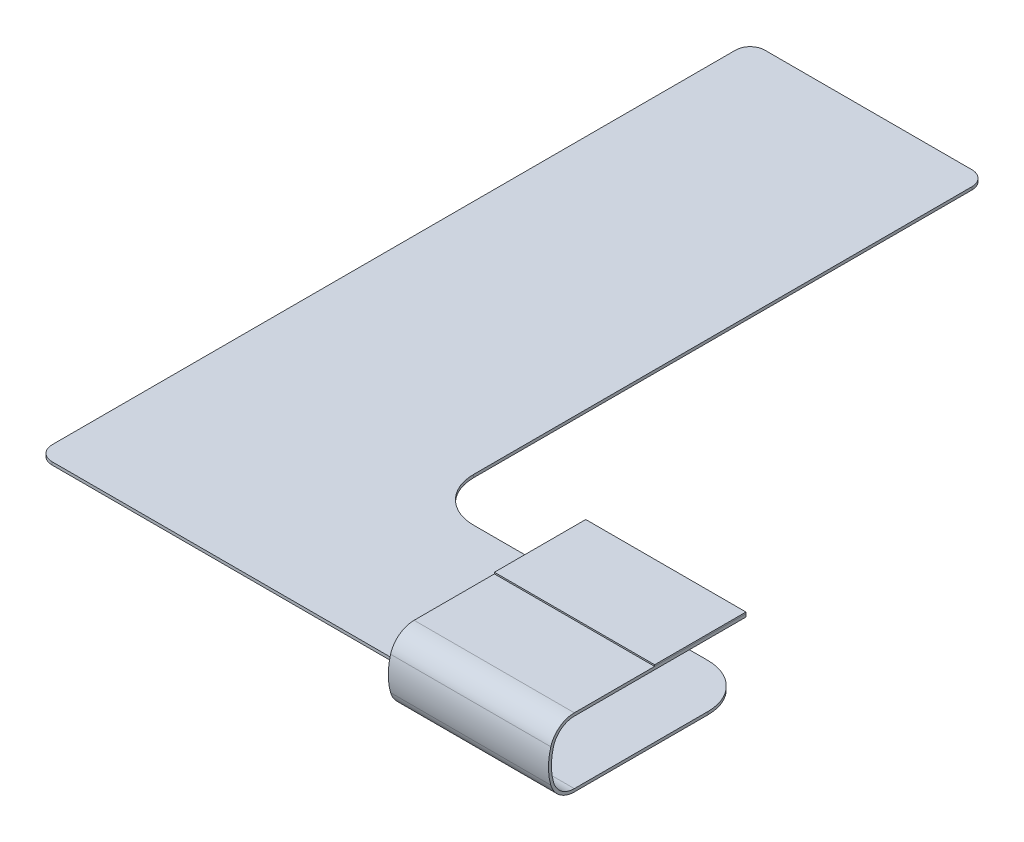
ISO-10303-21;
HEADER;
FILE_DESCRIPTION(('STEP AP214'),'2;1');
FILE_NAME('part.step','',(''),(''),'','','');
FILE_SCHEMA(('AUTOMOTIVE_DESIGN { 1 0 10303 214 1 1 1 1 }'));
ENDSEC;
DATA;
#1=APPLICATION_CONTEXT('core data for automotive mechanical design processes');
#2=APPLICATION_PROTOCOL_DEFINITION('international standard','automotive_design',2000,#1);
#3=PRODUCT_CONTEXT('',#1,'mechanical');
#4=PRODUCT('Part','Part','',(#3));
#5=PRODUCT_RELATED_PRODUCT_CATEGORY('part','',(#4));
#6=PRODUCT_DEFINITION_FORMATION('','',#4);
#7=PRODUCT_DEFINITION_CONTEXT('part definition',#1,'design');
#8=PRODUCT_DEFINITION('design','',#6,#7);
#9=PRODUCT_DEFINITION_SHAPE('','',#8);
#10=(LENGTH_UNIT() NAMED_UNIT(*) SI_UNIT(.MILLI.,.METRE.));
#11=(NAMED_UNIT(*) PLANE_ANGLE_UNIT() SI_UNIT($,.RADIAN.));
#12=(NAMED_UNIT(*) SI_UNIT($,.STERADIAN.) SOLID_ANGLE_UNIT());
#13=UNCERTAINTY_MEASURE_WITH_UNIT(LENGTH_MEASURE(1.E-05),#10,'distance_accuracy_value','');
#14=(GEOMETRIC_REPRESENTATION_CONTEXT(3) GLOBAL_UNCERTAINTY_ASSIGNED_CONTEXT((#13)) GLOBAL_UNIT_ASSIGNED_CONTEXT((#10,
#11,#12)) REPRESENTATION_CONTEXT('',''));
#15=CARTESIAN_POINT('',(0.,0.,0.));
#16=DIRECTION('',(0.,0.,1.));
#17=DIRECTION('',(1.,0.,0.));
#18=AXIS2_PLACEMENT_3D('',#15,#16,#17);
#19=CARTESIAN_POINT('',(-47.8987483955369,4.68,10.3694564606012));
#20=DIRECTION('',(0.,-1.,0.));
#21=DIRECTION('',(0.,0.,-1.));
#22=AXIS2_PLACEMENT_3D('',#19,#20,#21);
#23=PLANE('',#22);
#24=DIRECTION('',(0.,0.,-1.));
#25=VECTOR('',#24,1.);
#26=CARTESIAN_POINT('',(-58.8287483955369,4.68,4.13945646060121));
#27=LINE('',#26,#25);
#28=CARTESIAN_POINT('',(-58.8287483955369,4.68,10.3694564606012));
#29=VERTEX_POINT('',#28);
#30=CARTESIAN_POINT('',(-58.8287483955369,4.68,4.13945646060121));
#31=VERTEX_POINT('',#30);
#32=EDGE_CURVE('P0_E55',#29,#31,#27,.T.);
#33=ORIENTED_EDGE('',*,*,#32,.T.);
#34=DIRECTION('',(1.,0.,0.));
#35=VECTOR('',#34,1.);
#36=CARTESIAN_POINT('',(-47.8987483955369,4.68,4.13945646060121));
#37=LINE('',#36,#35);
#38=CARTESIAN_POINT('',(-47.8987483955369,4.68,4.13945646060121));
#39=VERTEX_POINT('',#38);
#40=EDGE_CURVE('P0_E76',#31,#39,#37,.T.);
#41=ORIENTED_EDGE('',*,*,#40,.T.);
#42=DIRECTION('',(0.,0.,1.));
#43=VECTOR('',#42,1.);
#44=CARTESIAN_POINT('',(-47.8987483955369,4.68,4.13945646060121));
#45=LINE('',#44,#43);
#46=CARTESIAN_POINT('',(-47.8987483955369,4.68,10.3694564606012));
#47=VERTEX_POINT('',#46);
#48=EDGE_CURVE('P0_E58',#39,#47,#45,.T.);
#49=ORIENTED_EDGE('',*,*,#48,.T.);
#50=DIRECTION('',(-1.,0.,0.));
#51=VECTOR('',#50,1.);
#52=CARTESIAN_POINT('',(-47.8987483955369,4.68,10.3694564606012));
#53=LINE('',#52,#51);
#54=EDGE_CURVE('P0_E20',#47,#29,#53,.T.);
#55=ORIENTED_EDGE('',*,*,#54,.T.);
#56=EDGE_LOOP('',(#33,#41,#49,#55));
#57=FACE_BOUND('',#56,.T.);
#58=ADVANCED_FACE('P0_F17',(#57),#23,.T.);
#59=CARTESIAN_POINT('',(-47.8987483955369,4.78,10.3694564606012));
#60=DIRECTION('',(0.,0.,-1.));
#61=DIRECTION('',(-1.,0.,0.));
#62=AXIS2_PLACEMENT_3D('',#59,#60,#61);
#63=PLANE('',#62);
#64=DIRECTION('',(0.,1.,0.));
#65=VECTOR('',#64,1.);
#66=CARTESIAN_POINT('',(-47.8987483955369,4.78,10.3694564606012));
#67=LINE('',#66,#65);
#68=CARTESIAN_POINT('',(-47.8987483955369,4.78,10.3694564606012));
#69=VERTEX_POINT('',#68);
#70=EDGE_CURVE('P0_E78',#47,#69,#67,.T.);
#71=ORIENTED_EDGE('',*,*,#70,.T.);
#72=DIRECTION('',(1.,0.,0.));
#73=VECTOR('',#72,1.);
#74=CARTESIAN_POINT('',(-47.8987483955369,4.78,10.3694564606012));
#75=LINE('',#74,#73);
#76=CARTESIAN_POINT('',(-58.8287483955369,4.78,10.3694564606012));
#77=VERTEX_POINT('',#76);
#78=EDGE_CURVE('P0_E73',#69,#77,#75,.F.);
#79=ORIENTED_EDGE('',*,*,#78,.T.);
#80=DIRECTION('',(0.,1.,0.));
#81=VECTOR('',#80,1.);
#82=CARTESIAN_POINT('',(-58.8287483955369,4.78,10.3694564606012));
#83=LINE('',#82,#81);
#84=EDGE_CURVE('P0_E63',#77,#29,#83,.F.);
#85=ORIENTED_EDGE('',*,*,#84,.T.);
#86=ORIENTED_EDGE('',*,*,#54,.F.);
#87=EDGE_LOOP('',(#71,#79,#85,#86));
#88=FACE_BOUND('',#87,.T.);
#89=ADVANCED_FACE('P0_F72',(#88),#63,.F.);
#90=CARTESIAN_POINT('',(-58.8287483955369,4.78,4.13945646060121));
#91=DIRECTION('',(1.,0.,0.));
#92=DIRECTION('',(0.,0.,-1.));
#93=AXIS2_PLACEMENT_3D('',#90,#91,#92);
#94=PLANE('',#93);
#95=ORIENTED_EDGE('',*,*,#84,.F.);
#96=DIRECTION('',(0.,0.,-1.));
#97=VECTOR('',#96,1.);
#98=CARTESIAN_POINT('',(-58.8287483955369,4.78,10.3694564606012));
#99=LINE('',#98,#97);
#100=CARTESIAN_POINT('',(-58.8287483955369,4.78,4.13945646060121));
#101=VERTEX_POINT('',#100);
#102=EDGE_CURVE('P0_E83',#77,#101,#99,.T.);
#103=ORIENTED_EDGE('',*,*,#102,.T.);
#104=DIRECTION('',(0.,1.,0.));
#105=VECTOR('',#104,1.);
#106=CARTESIAN_POINT('',(-58.8287483955369,4.78,4.13945646060121));
#107=LINE('',#106,#105);
#108=EDGE_CURVE('P0_E69',#101,#31,#107,.F.);
#109=ORIENTED_EDGE('',*,*,#108,.T.);
#110=ORIENTED_EDGE('',*,*,#32,.F.);
#111=EDGE_LOOP('',(#95,#103,#109,#110));
#112=FACE_BOUND('',#111,.T.);
#113=ADVANCED_FACE('P0_F66',(#112),#94,.F.);
#114=CARTESIAN_POINT('',(-47.8987483955369,4.78,4.13945646060121));
#115=DIRECTION('',(0.,0.,1.));
#116=DIRECTION('',(1.,0.,0.));
#117=AXIS2_PLACEMENT_3D('',#114,#115,#116);
#118=PLANE('',#117);
#119=ORIENTED_EDGE('',*,*,#108,.F.);
#120=DIRECTION('',(1.,0.,0.));
#121=VECTOR('',#120,1.);
#122=CARTESIAN_POINT('',(-47.8987483955369,4.78,4.13945646060121));
#123=LINE('',#122,#121);
#124=CARTESIAN_POINT('',(-47.8987483955369,4.78,4.13945646060121));
#125=VERTEX_POINT('',#124);
#126=EDGE_CURVE('P0_E26',#101,#125,#123,.T.);
#127=ORIENTED_EDGE('',*,*,#126,.T.);
#128=DIRECTION('',(0.,1.,0.));
#129=VECTOR('',#128,1.);
#130=CARTESIAN_POINT('',(-47.8987483955369,4.78,4.13945646060121));
#131=LINE('',#130,#129);
#132=EDGE_CURVE('P0_E34',#125,#39,#131,.F.);
#133=ORIENTED_EDGE('',*,*,#132,.T.);
#134=ORIENTED_EDGE('',*,*,#40,.F.);
#135=EDGE_LOOP('',(#119,#127,#133,#134));
#136=FACE_BOUND('',#135,.T.);
#137=ADVANCED_FACE('P0_F88',(#136),#118,.F.);
#138=CARTESIAN_POINT('',(-47.8987483955369,4.78,4.13945646060121));
#139=DIRECTION('',(-1.,0.,0.));
#140=DIRECTION('',(0.,0.,1.));
#141=AXIS2_PLACEMENT_3D('',#138,#139,#140);
#142=PLANE('',#141);
#143=ORIENTED_EDGE('',*,*,#132,.F.);
#144=DIRECTION('',(0.,0.,-1.));
#145=VECTOR('',#144,1.);
#146=CARTESIAN_POINT('',(-47.8987483955369,4.78,10.3694564606012));
#147=LINE('',#146,#145);
#148=EDGE_CURVE('P0_E11',#125,#69,#147,.F.);
#149=ORIENTED_EDGE('',*,*,#148,.T.);
#150=ORIENTED_EDGE('',*,*,#70,.F.);
#151=ORIENTED_EDGE('',*,*,#48,.F.);
#152=EDGE_LOOP('',(#143,#149,#150,#151));
#153=FACE_BOUND('',#152,.T.);
#154=ADVANCED_FACE('P0_F91',(#153),#142,.F.);
#155=CARTESIAN_POINT('',(-47.8987483955369,4.78,10.3694564606012));
#156=DIRECTION('',(0.,-1.,0.));
#157=DIRECTION('',(0.,0.,-1.));
#158=AXIS2_PLACEMENT_3D('',#155,#156,#157);
#159=PLANE('',#158);
#160=ORIENTED_EDGE('',*,*,#126,.F.);
#161=ORIENTED_EDGE('',*,*,#102,.F.);
#162=ORIENTED_EDGE('',*,*,#78,.F.);
#163=ORIENTED_EDGE('',*,*,#148,.F.);
#164=EDGE_LOOP('',(#160,#161,#162,#163));
#165=FACE_BOUND('',#164,.T.);
#166=ADVANCED_FACE('P0_F90',(#165),#159,.F.);
#167=CLOSED_SHELL('',(#58,#89,#113,#137,#154,#166));
#168=MANIFOLD_SOLID_BREP('P0_B1',#167);
#169=CARTESIAN_POINT('',(-58.8287483955369,2.34,13.5306617763399));
#170=DIRECTION('',(-1.,0.,0.));
#171=DIRECTION('',(0.,0.,1.));
#172=AXIS2_PLACEMENT_3D('',#169,#170,#171);
#173=CYLINDRICAL_SURFACE('',#172,4.08307330034227);
#174=DIRECTION('',(-1.,0.,0.));
#175=VECTOR('',#174,1.);
#176=CARTESIAN_POINT('',(-58.8287483955369,3.47430917471786,17.4530118718972));
#177=LINE('',#176,#175);
#178=CARTESIAN_POINT('',(-58.8287483955369,3.47430917471786,17.4530118718972));
#179=VERTEX_POINT('',#178);
#180=CARTESIAN_POINT('',(-47.8987483955369,3.47430917471786,17.4530118718972));
#181=VERTEX_POINT('',#180);
#182=EDGE_CURVE('P1_E206',#179,#181,#177,.F.);
#183=ORIENTED_EDGE('',*,*,#182,.F.);
#184=CARTESIAN_POINT('',(-58.8287483955369,2.34,13.5306617763399));
#185=DIRECTION('',(-1.,0.,0.));
#186=DIRECTION('',(0.,0.,1.));
#187=AXIS2_PLACEMENT_3D('',#184,#185,#186);
#188=CIRCLE('',#187,4.08307330034227);
#189=CARTESIAN_POINT('',(-58.8287483955369,1.20569082528214,17.4530118718972));
#190=VERTEX_POINT('',#189);
#191=EDGE_CURVE('P1_E161',#179,#190,#188,.F.);
#192=ORIENTED_EDGE('',*,*,#191,.T.);
#193=DIRECTION('',(1.,0.,0.));
#194=VECTOR('',#193,1.);
#195=CARTESIAN_POINT('',(-58.8287483955369,1.20569082528214,17.4530118718972));
#196=LINE('',#195,#194);
#197=CARTESIAN_POINT('',(-47.8987483955369,1.20569082528214,17.4530118718972));
#198=VERTEX_POINT('',#197);
#199=EDGE_CURVE('P1_E160',#198,#190,#196,.F.);
#200=ORIENTED_EDGE('',*,*,#199,.F.);
#201=CARTESIAN_POINT('',(-47.8987483955369,2.34,13.5306617763399));
#202=DIRECTION('',(-1.,0.,0.));
#203=DIRECTION('',(0.,0.,1.));
#204=AXIS2_PLACEMENT_3D('',#201,#202,#203);
#205=CIRCLE('',#204,4.08307330034227);
#206=EDGE_CURVE('P1_E20',#198,#181,#205,.T.);
#207=ORIENTED_EDGE('',*,*,#206,.T.);
#208=EDGE_LOOP('',(#183,#192,#200,#207));
#209=FACE_BOUND('',#208,.T.);
#210=ADVANCED_FACE('P1_F17',(#209),#173,.T.);
#211=CARTESIAN_POINT('',(-58.8287483955369,4.68,4.13945646060121));
#212=DIRECTION('',(0.,0.,-1.));
#213=DIRECTION('',(0.,1.,0.));
#214=AXIS2_PLACEMENT_3D('',#211,#212,#213);
#215=PLANE('',#214);
#216=DIRECTION('',(0.,1.,0.));
#217=VECTOR('',#216,1.);
#218=CARTESIAN_POINT('',(-47.8987483955369,4.68,4.13945646060121));
#219=LINE('',#218,#217);
#220=CARTESIAN_POINT('',(-47.8987483955369,4.68,4.13945646060121));
#221=VERTEX_POINT('',#220);
#222=CARTESIAN_POINT('',(-47.8987483955369,4.48,4.13945646060121));
#223=VERTEX_POINT('',#222);
#224=EDGE_CURVE('P1_E158',#221,#223,#219,.F.);
#225=ORIENTED_EDGE('',*,*,#224,.T.);
#226=DIRECTION('',(1.,0.,0.));
#227=VECTOR('',#226,1.);
#228=CARTESIAN_POINT('',(-58.8287483955369,4.48,4.13945646060121));
#229=LINE('',#228,#227);
#230=CARTESIAN_POINT('',(-58.8287483955369,4.48,4.13945646060121));
#231=VERTEX_POINT('',#230);
#232=EDGE_CURVE('P1_E309',#231,#223,#229,.T.);
#233=ORIENTED_EDGE('',*,*,#232,.F.);
#234=DIRECTION('',(0.,1.,0.));
#235=VECTOR('',#234,1.);
#236=CARTESIAN_POINT('',(-58.8287483955369,0.2,4.13945646060121));
#237=LINE('',#236,#235);
#238=CARTESIAN_POINT('',(-58.8287483955369,4.68,4.13945646060121));
#239=VERTEX_POINT('',#238);
#240=EDGE_CURVE('P1_E210',#231,#239,#237,.T.);
#241=ORIENTED_EDGE('',*,*,#240,.T.);
#242=DIRECTION('',(1.,0.,0.));
#243=VECTOR('',#242,1.);
#244=CARTESIAN_POINT('',(-58.8287483955369,4.68,4.13945646060121));
#245=LINE('',#244,#243);
#246=EDGE_CURVE('P1_E230',#221,#239,#245,.F.);
#247=ORIENTED_EDGE('',*,*,#246,.F.);
#248=EDGE_LOOP('',(#225,#233,#241,#247));
#249=FACE_BOUND('',#248,.T.);
#250=ADVANCED_FACE('P1_F334',(#249),#215,.T.);
#251=CARTESIAN_POINT('',(-58.8287483955369,0.2,14.3492411658369));
#252=DIRECTION('',(1.,0.,0.));
#253=DIRECTION('',(0.,0.,-1.));
#254=AXIS2_PLACEMENT_3D('',#251,#252,#253);
#255=PLANE('',#254);
#256=CARTESIAN_POINT('',(-58.8287483955369,1.66948721818661,15.8492411658369));
#257=DIRECTION('',(1.,0.,0.));
#258=DIRECTION('',(0.,0.,-1.));
#259=AXIS2_PLACEMENT_3D('',#256,#257,#258);
#260=CIRCLE('',#259,1.6694872181866);
#261=CARTESIAN_POINT('',(-58.8287483955369,0.,15.8492411658369));
#262=VERTEX_POINT('',#261);
#263=EDGE_CURVE('P1_E165',#190,#262,#260,.T.);
#264=ORIENTED_EDGE('',*,*,#263,.F.);
#265=ORIENTED_EDGE('',*,*,#191,.F.);
#266=CARTESIAN_POINT('',(-58.8287483955369,3.0105127818134,15.8492411658369));
#267=DIRECTION('',(-1.,0.,0.));
#268=DIRECTION('',(0.,0.,1.));
#269=AXIS2_PLACEMENT_3D('',#266,#267,#268);
#270=CIRCLE('',#269,1.6694872181866);
#271=CARTESIAN_POINT('',(-58.8287483955369,4.68,15.8492411658369));
#272=VERTEX_POINT('',#271);
#273=EDGE_CURVE('P1_E202',#272,#179,#270,.F.);
#274=ORIENTED_EDGE('',*,*,#273,.F.);
#275=DIRECTION('',(0.,0.,1.));
#276=VECTOR('',#275,1.);
#277=CARTESIAN_POINT('',(-58.8287483955369,4.68,15.8492411658369));
#278=LINE('',#277,#276);
#279=EDGE_CURVE('P1_E226',#239,#272,#278,.T.);
#280=ORIENTED_EDGE('',*,*,#279,.F.);
#281=ORIENTED_EDGE('',*,*,#240,.F.);
#282=DIRECTION('',(0.,0.,-1.));
#283=VECTOR('',#282,1.);
#284=CARTESIAN_POINT('',(-58.8287483955369,4.48,15.8492411658369));
#285=LINE('',#284,#283);
#286=CARTESIAN_POINT('',(-58.8287483955369,4.48,15.8492411658369));
#287=VERTEX_POINT('',#286);
#288=EDGE_CURVE('P1_E229',#287,#231,#285,.T.);
#289=ORIENTED_EDGE('',*,*,#288,.F.);
#290=CARTESIAN_POINT('',(-58.8287483955369,3.0105127818134,15.8492411658369));
#291=DIRECTION('',(-1.,0.,0.));
#292=DIRECTION('',(0.,0.,1.));
#293=AXIS2_PLACEMENT_3D('',#290,#291,#292);
#294=CIRCLE('',#293,1.46948721818661);
#295=CARTESIAN_POINT('',(-58.8287483955369,3.41874763607868,17.2608845302094));
#296=VERTEX_POINT('',#295);
#297=EDGE_CURVE('P1_E197',#287,#296,#294,.F.);
#298=ORIENTED_EDGE('',*,*,#297,.T.);
#299=CARTESIAN_POINT('',(-58.8287483955369,2.34,13.5306617763399));
#300=DIRECTION('',(-1.,0.,0.));
#301=DIRECTION('',(0.,0.,1.));
#302=AXIS2_PLACEMENT_3D('',#299,#300,#301);
#303=CIRCLE('',#302,3.88307330034227);
#304=CARTESIAN_POINT('',(-58.8287483955369,1.26125236392132,17.2608845302094));
#305=VERTEX_POINT('',#304);
#306=EDGE_CURVE('P1_E209',#296,#305,#303,.F.);
#307=ORIENTED_EDGE('',*,*,#306,.T.);
#308=CARTESIAN_POINT('',(-58.8287483955369,1.66948721818661,15.8492411658369));
#309=DIRECTION('',(1.,0.,0.));
#310=DIRECTION('',(0.,0.,-1.));
#311=AXIS2_PLACEMENT_3D('',#308,#309,#310);
#312=CIRCLE('',#311,1.46948721818661);
#313=CARTESIAN_POINT('',(-58.8287483955369,0.2,15.8492411658369));
#314=VERTEX_POINT('',#313);
#315=EDGE_CURVE('P1_E177',#305,#314,#312,.T.);
#316=ORIENTED_EDGE('',*,*,#315,.T.);
#317=DIRECTION('',(0.,0.,-1.));
#318=VECTOR('',#317,1.);
#319=CARTESIAN_POINT('',(-58.8287483955369,0.2,14.3492411658369));
#320=LINE('',#319,#318);
#321=CARTESIAN_POINT('',(-58.8287483955369,0.2,14.3492411658369));
#322=VERTEX_POINT('',#321);
#323=EDGE_CURVE('P1_E212',#322,#314,#320,.F.);
#324=ORIENTED_EDGE('',*,*,#323,.F.);
#325=DIRECTION('',(0.,1.,0.));
#326=VECTOR('',#325,1.);
#327=CARTESIAN_POINT('',(-58.8287483955369,0.2,14.3492411658369));
#328=LINE('',#327,#326);
#329=CARTESIAN_POINT('',(-58.8287483955369,0.,14.3492411658369));
#330=VERTEX_POINT('',#329);
#331=EDGE_CURVE('P1_E187',#322,#330,#328,.F.);
#332=ORIENTED_EDGE('',*,*,#331,.T.);
#333=DIRECTION('',(0.,0.,1.));
#334=VECTOR('',#333,1.);
#335=CARTESIAN_POINT('',(-58.8287483955369,0.,14.3492411658369));
#336=LINE('',#335,#334);
#337=EDGE_CURVE('P1_E304',#330,#262,#336,.T.);
#338=ORIENTED_EDGE('',*,*,#337,.T.);
#339=EDGE_LOOP('',(#264,#265,#274,#280,#281,#289,#298,#307,#316,#324,#332,#338));
#340=FACE_BOUND('',#339,.T.);
#341=ADVANCED_FACE('P1_F344',(#340),#255,.F.);
#342=CARTESIAN_POINT('',(-58.8287483955369,2.34,13.5306617763399));
#343=DIRECTION('',(-1.,0.,0.));
#344=DIRECTION('',(0.,0.,1.));
#345=AXIS2_PLACEMENT_3D('',#342,#343,#344);
#346=CYLINDRICAL_SURFACE('',#345,3.88307330034227);
#347=CARTESIAN_POINT('',(-47.8987483955369,2.34,13.5306617763399));
#348=DIRECTION('',(-1.,0.,0.));
#349=DIRECTION('',(0.,0.,1.));
#350=AXIS2_PLACEMENT_3D('',#347,#348,#349);
#351=CIRCLE('',#350,3.88307330034227);
#352=CARTESIAN_POINT('',(-47.8987483955369,1.26125236392132,17.2608845302094));
#353=VERTEX_POINT('',#352);
#354=CARTESIAN_POINT('',(-47.8987483955369,3.41874763607868,17.2608845302094));
#355=VERTEX_POINT('',#354);
#356=EDGE_CURVE('P1_E166',#353,#355,#351,.T.);
#357=ORIENTED_EDGE('',*,*,#356,.F.);
#358=DIRECTION('',(1.,0.,0.));
#359=VECTOR('',#358,1.);
#360=CARTESIAN_POINT('',(-58.8287483955369,1.26125236392133,17.2608845302094));
#361=LINE('',#360,#359);
#362=EDGE_CURVE('P1_E172',#353,#305,#361,.F.);
#363=ORIENTED_EDGE('',*,*,#362,.T.);
#364=ORIENTED_EDGE('',*,*,#306,.F.);
#365=DIRECTION('',(-1.,0.,0.));
#366=VECTOR('',#365,1.);
#367=CARTESIAN_POINT('',(-58.8287483955369,3.41874763607868,17.2608845302094));
#368=LINE('',#367,#366);
#369=EDGE_CURVE('P1_E200',#296,#355,#368,.F.);
#370=ORIENTED_EDGE('',*,*,#369,.T.);
#371=EDGE_LOOP('',(#357,#363,#364,#370));
#372=FACE_BOUND('',#371,.T.);
#373=ADVANCED_FACE('P1_F340',(#372),#346,.F.);
#374=CARTESIAN_POINT('',(-58.8287483955369,1.66948721818661,15.8492411658369));
#375=DIRECTION('',(1.,0.,0.));
#376=DIRECTION('',(0.,0.,-1.));
#377=AXIS2_PLACEMENT_3D('',#374,#375,#376);
#378=CYLINDRICAL_SURFACE('',#377,1.6694872181866);
#379=ORIENTED_EDGE('',*,*,#263,.T.);
#380=DIRECTION('',(1.,0.,0.));
#381=VECTOR('',#380,1.);
#382=CARTESIAN_POINT('',(-86.0287483955369,0.,15.8492411658369));
#383=LINE('',#382,#381);
#384=CARTESIAN_POINT('',(-47.8987483955369,0.,15.8492411658369));
#385=VERTEX_POINT('',#384);
#386=EDGE_CURVE('P1_E170',#262,#385,#383,.T.);
#387=ORIENTED_EDGE('',*,*,#386,.T.);
#388=CARTESIAN_POINT('',(-47.8987483955369,1.66948721818661,15.8492411658369));
#389=DIRECTION('',(1.,0.,0.));
#390=DIRECTION('',(0.,0.,-1.));
#391=AXIS2_PLACEMENT_3D('',#388,#389,#390);
#392=CIRCLE('',#391,1.6694872181866);
#393=EDGE_CURVE('P1_E155',#385,#198,#392,.F.);
#394=ORIENTED_EDGE('',*,*,#393,.T.);
#395=ORIENTED_EDGE('',*,*,#199,.T.);
#396=EDGE_LOOP('',(#379,#387,#394,#395));
#397=FACE_BOUND('',#396,.T.);
#398=ADVANCED_FACE('P1_F168',(#397),#378,.T.);
#399=CARTESIAN_POINT('',(-58.8287483955369,3.0105127818134,15.8492411658369));
#400=DIRECTION('',(-1.,0.,0.));
#401=DIRECTION('',(0.,0.,1.));
#402=AXIS2_PLACEMENT_3D('',#399,#400,#401);
#403=CYLINDRICAL_SURFACE('',#402,1.6694872181866);
#404=DIRECTION('',(1.,0.,0.));
#405=VECTOR('',#404,1.);
#406=CARTESIAN_POINT('',(-58.8287483955369,4.68,15.8492411658369));
#407=LINE('',#406,#405);
#408=CARTESIAN_POINT('',(-47.8987483955369,4.68,15.8492411658369));
#409=VERTEX_POINT('',#408);
#410=EDGE_CURVE('P1_E205',#272,#409,#407,.T.);
#411=ORIENTED_EDGE('',*,*,#410,.F.);
#412=ORIENTED_EDGE('',*,*,#273,.T.);
#413=ORIENTED_EDGE('',*,*,#182,.T.);
#414=CARTESIAN_POINT('',(-47.8987483955369,3.0105127818134,15.8492411658369));
#415=DIRECTION('',(-1.,0.,0.));
#416=DIRECTION('',(0.,0.,1.));
#417=AXIS2_PLACEMENT_3D('',#414,#415,#416);
#418=CIRCLE('',#417,1.6694872181866);
#419=EDGE_CURVE('P1_E157',#181,#409,#418,.T.);
#420=ORIENTED_EDGE('',*,*,#419,.T.);
#421=EDGE_LOOP('',(#411,#412,#413,#420));
#422=FACE_BOUND('',#421,.T.);
#423=ADVANCED_FACE('P1_F544',(#422),#403,.T.);
#424=CARTESIAN_POINT('',(-58.8287483955369,4.68,15.8492411658369));
#425=DIRECTION('',(0.,1.,0.));
#426=DIRECTION('',(0.,0.,1.));
#427=AXIS2_PLACEMENT_3D('',#424,#425,#426);
#428=PLANE('',#427);
#429=ORIENTED_EDGE('',*,*,#246,.T.);
#430=ORIENTED_EDGE('',*,*,#279,.T.);
#431=ORIENTED_EDGE('',*,*,#410,.T.);
#432=DIRECTION('',(0.,0.,1.));
#433=VECTOR('',#432,1.);
#434=CARTESIAN_POINT('',(-47.8987483955369,4.68,15.8492411658369));
#435=LINE('',#434,#433);
#436=EDGE_CURVE('P1_E174',#409,#221,#435,.F.);
#437=ORIENTED_EDGE('',*,*,#436,.T.);
#438=EDGE_LOOP('',(#429,#430,#431,#437));
#439=FACE_BOUND('',#438,.T.);
#440=ADVANCED_FACE('P1_F536',(#439),#428,.T.);
#441=CARTESIAN_POINT('',(-58.8287483955369,4.48,15.8492411658369));
#442=DIRECTION('',(0.,-1.,0.));
#443=DIRECTION('',(0.,0.,-1.));
#444=AXIS2_PLACEMENT_3D('',#441,#442,#443);
#445=PLANE('',#444);
#446=ORIENTED_EDGE('',*,*,#232,.T.);
#447=DIRECTION('',(0.,0.,1.));
#448=VECTOR('',#447,1.);
#449=CARTESIAN_POINT('',(-47.8987483955369,4.48,15.8492411658369));
#450=LINE('',#449,#448);
#451=CARTESIAN_POINT('',(-47.8987483955369,4.48,15.8492411658369));
#452=VERTEX_POINT('',#451);
#453=EDGE_CURVE('P1_E262',#223,#452,#450,.T.);
#454=ORIENTED_EDGE('',*,*,#453,.T.);
#455=DIRECTION('',(-1.,0.,0.));
#456=VECTOR('',#455,1.);
#457=CARTESIAN_POINT('',(-58.8287483955369,4.48,15.8492411658369));
#458=LINE('',#457,#456);
#459=EDGE_CURVE('P1_E201',#452,#287,#458,.T.);
#460=ORIENTED_EDGE('',*,*,#459,.T.);
#461=ORIENTED_EDGE('',*,*,#288,.T.);
#462=EDGE_LOOP('',(#446,#454,#460,#461));
#463=FACE_BOUND('',#462,.T.);
#464=ADVANCED_FACE('P1_F335',(#463),#445,.T.);
#465=CARTESIAN_POINT('',(-58.8287483955369,3.0105127818134,15.8492411658369));
#466=DIRECTION('',(-1.,0.,0.));
#467=DIRECTION('',(0.,0.,1.));
#468=AXIS2_PLACEMENT_3D('',#465,#466,#467);
#469=CYLINDRICAL_SURFACE('',#468,1.46948721818661);
#470=ORIENTED_EDGE('',*,*,#297,.F.);
#471=ORIENTED_EDGE('',*,*,#459,.F.);
#472=CARTESIAN_POINT('',(-47.8987483955369,3.0105127818134,15.8492411658369));
#473=DIRECTION('',(-1.,0.,0.));
#474=DIRECTION('',(0.,0.,1.));
#475=AXIS2_PLACEMENT_3D('',#472,#473,#474);
#476=CIRCLE('',#475,1.46948721818661);
#477=EDGE_CURVE('P1_E260',#452,#355,#476,.F.);
#478=ORIENTED_EDGE('',*,*,#477,.T.);
#479=ORIENTED_EDGE('',*,*,#369,.F.);
#480=EDGE_LOOP('',(#470,#471,#478,#479));
#481=FACE_BOUND('',#480,.T.);
#482=ADVANCED_FACE('P1_F342',(#481),#469,.F.);
#483=CARTESIAN_POINT('',(-86.0287483955369,0.,14.3492411658369));
#484=DIRECTION('',(0.,1.,0.));
#485=DIRECTION('',(0.,0.,1.));
#486=AXIS2_PLACEMENT_3D('',#483,#484,#485);
#487=PLANE('',#486);
#488=CARTESIAN_POINT('',(-85.0287483955369,0.,-33.2784537478612));
#489=DIRECTION('',(0.,-1.,0.));
#490=DIRECTION('',(0.,0.,-1.));
#491=AXIS2_PLACEMENT_3D('',#488,#489,#490);
#492=CIRCLE('',#491,1.);
#493=CARTESIAN_POINT('',(-85.0287483955369,0.,-34.2784537478612));
#494=VERTEX_POINT('',#493);
#495=CARTESIAN_POINT('',(-86.0287483955369,0.,-33.2784537478612));
#496=VERTEX_POINT('',#495);
#497=EDGE_CURVE('P1_E189',#494,#496,#492,.F.);
#498=ORIENTED_EDGE('',*,*,#497,.F.);
#499=DIRECTION('',(1.,0.,0.));
#500=VECTOR('',#499,1.);
#501=CARTESIAN_POINT('',(-69.8987483955369,0.,-34.2784537478612));
#502=LINE('',#501,#500);
#503=CARTESIAN_POINT('',(-70.8987483955369,0.,-34.2784537478612));
#504=VERTEX_POINT('',#503);
#505=EDGE_CURVE('P1_E196',#494,#504,#502,.T.);
#506=ORIENTED_EDGE('',*,*,#505,.T.);
#507=CARTESIAN_POINT('',(-70.8987483955369,0.,-33.2784537478612));
#508=DIRECTION('',(0.,-1.,0.));
#509=DIRECTION('',(0.,0.,-1.));
#510=AXIS2_PLACEMENT_3D('',#507,#508,#509);
#511=CIRCLE('',#510,1.);
#512=CARTESIAN_POINT('',(-69.8987483955369,0.,-33.2784537478612));
#513=VERTEX_POINT('',#512);
#514=EDGE_CURVE('P1_E194',#513,#504,#511,.F.);
#515=ORIENTED_EDGE('',*,*,#514,.F.);
#516=DIRECTION('',(0.,0.,1.));
#517=VECTOR('',#516,1.);
#518=CARTESIAN_POINT('',(-69.8987483955369,0.,3.71924116583694));
#519=LINE('',#518,#517);
#520=CARTESIAN_POINT('',(-69.8987483955369,0.,0.719241165836939));
#521=VERTEX_POINT('',#520);
#522=EDGE_CURVE('P1_E298',#513,#521,#519,.T.);
#523=ORIENTED_EDGE('',*,*,#522,.T.);
#524=CARTESIAN_POINT('',(-66.8987483955369,0.,0.719241165836939));
#525=DIRECTION('',(0.,1.,0.));
#526=DIRECTION('',(0.,0.,1.));
#527=AXIS2_PLACEMENT_3D('',#524,#525,#526);
#528=CIRCLE('',#527,3.);
#529=CARTESIAN_POINT('',(-66.8987483955369,0.,3.71924116583694));
#530=VERTEX_POINT('',#529);
#531=EDGE_CURVE('P1_E250',#521,#530,#528,.T.);
#532=ORIENTED_EDGE('',*,*,#531,.T.);
#533=DIRECTION('',(1.,0.,0.));
#534=VECTOR('',#533,1.);
#535=CARTESIAN_POINT('',(-47.8987483955369,0.,3.71924116583694));
#536=LINE('',#535,#534);
#537=CARTESIAN_POINT('',(-50.8987483955369,0.,3.71924116583694));
#538=VERTEX_POINT('',#537);
#539=EDGE_CURVE('P1_E253',#530,#538,#536,.T.);
#540=ORIENTED_EDGE('',*,*,#539,.T.);
#541=CARTESIAN_POINT('',(-50.8987483955369,0.,6.71924116583694));
#542=DIRECTION('',(0.,-1.,0.));
#543=DIRECTION('',(0.,0.,-1.));
#544=AXIS2_PLACEMENT_3D('',#541,#542,#543);
#545=CIRCLE('',#544,3.);
#546=CARTESIAN_POINT('',(-47.8987483955369,0.,6.71924116583694));
#547=VERTEX_POINT('',#546);
#548=EDGE_CURVE('P1_E254',#547,#538,#545,.F.);
#549=ORIENTED_EDGE('',*,*,#548,.F.);
#550=DIRECTION('',(0.,0.,1.));
#551=VECTOR('',#550,1.);
#552=CARTESIAN_POINT('',(-47.8987483955369,0.,15.8492411658369));
#553=LINE('',#552,#551);
#554=EDGE_CURVE('P1_E259',#547,#385,#553,.T.);
#555=ORIENTED_EDGE('',*,*,#554,.T.);
#556=ORIENTED_EDGE('',*,*,#386,.F.);
#557=ORIENTED_EDGE('',*,*,#337,.F.);
#558=DIRECTION('',(-1.,0.,0.));
#559=VECTOR('',#558,1.);
#560=CARTESIAN_POINT('',(-86.0287483955369,0.,14.3492411658369));
#561=LINE('',#560,#559);
#562=CARTESIAN_POINT('',(-85.0287483955369,0.,14.3492411658369));
#563=VERTEX_POINT('',#562);
#564=EDGE_CURVE('P1_E285',#330,#563,#561,.T.);
#565=ORIENTED_EDGE('',*,*,#564,.T.);
#566=CARTESIAN_POINT('',(-85.0287483955369,0.,13.3492411658369));
#567=DIRECTION('',(0.,-1.,0.));
#568=DIRECTION('',(0.,0.,-1.));
#569=AXIS2_PLACEMENT_3D('',#566,#567,#568);
#570=CIRCLE('',#569,1.);
#571=CARTESIAN_POINT('',(-86.0287483955369,0.,13.3492411658369));
#572=VERTEX_POINT('',#571);
#573=EDGE_CURVE('P1_E184',#572,#563,#570,.F.);
#574=ORIENTED_EDGE('',*,*,#573,.F.);
#575=DIRECTION('',(0.,0.,-1.));
#576=VECTOR('',#575,1.);
#577=CARTESIAN_POINT('',(-86.0287483955369,0.,-34.2784537478612));
#578=LINE('',#577,#576);
#579=EDGE_CURVE('P1_E192',#572,#496,#578,.T.);
#580=ORIENTED_EDGE('',*,*,#579,.T.);
#581=EDGE_LOOP('',(#498,#506,#515,#523,#532,#540,#549,#555,#556,#557,#565,#574,#580));
#582=FACE_BOUND('',#581,.T.);
#583=ADVANCED_FACE('P1_F386',(#582),#487,.F.);
#584=CARTESIAN_POINT('',(-69.8987483955369,0.2,-34.2784537478612));
#585=DIRECTION('',(0.,0.,1.));
#586=DIRECTION('',(1.,0.,0.));
#587=AXIS2_PLACEMENT_3D('',#584,#585,#586);
#588=PLANE('',#587);
#589=DIRECTION('',(0.,-1.,0.));
#590=VECTOR('',#589,1.);
#591=CARTESIAN_POINT('',(-85.0287483955369,0.2,-34.2784537478612));
#592=LINE('',#591,#590);
#593=CARTESIAN_POINT('',(-85.0287483955369,0.2,-34.2784537478612));
#594=VERTEX_POINT('',#593);
#595=EDGE_CURVE('P1_E193',#594,#494,#592,.T.);
#596=ORIENTED_EDGE('',*,*,#595,.F.);
#597=DIRECTION('',(1.,0.,0.));
#598=VECTOR('',#597,1.);
#599=CARTESIAN_POINT('',(-86.0287483955369,0.2,-34.2784537478612));
#600=LINE('',#599,#598);
#601=CARTESIAN_POINT('',(-70.8987483955369,0.2,-34.2784537478612));
#602=VERTEX_POINT('',#601);
#603=EDGE_CURVE('P1_E249',#602,#594,#600,.F.);
#604=ORIENTED_EDGE('',*,*,#603,.F.);
#605=DIRECTION('',(0.,-1.,0.));
#606=VECTOR('',#605,1.);
#607=CARTESIAN_POINT('',(-70.8987483955369,0.2,-34.2784537478612));
#608=LINE('',#607,#606);
#609=EDGE_CURVE('P1_E374',#504,#602,#608,.F.);
#610=ORIENTED_EDGE('',*,*,#609,.F.);
#611=ORIENTED_EDGE('',*,*,#505,.F.);
#612=EDGE_LOOP('',(#596,#604,#610,#611));
#613=FACE_BOUND('',#612,.T.);
#614=ADVANCED_FACE('P1_F505',(#613),#588,.F.);
#615=CARTESIAN_POINT('',(-85.0287483955369,0.2,-33.2784537478612));
#616=DIRECTION('',(0.,-1.,0.));
#617=DIRECTION('',(0.,0.,-1.));
#618=AXIS2_PLACEMENT_3D('',#615,#616,#617);
#619=CYLINDRICAL_SURFACE('',#618,1.);
#620=ORIENTED_EDGE('',*,*,#497,.T.);
#621=DIRECTION('',(0.,1.,0.));
#622=VECTOR('',#621,1.);
#623=CARTESIAN_POINT('',(-86.0287483955369,0.2,-33.2784537478612));
#624=LINE('',#623,#622);
#625=CARTESIAN_POINT('',(-86.0287483955369,0.2,-33.2784537478612));
#626=VERTEX_POINT('',#625);
#627=EDGE_CURVE('P1_E292',#496,#626,#624,.T.);
#628=ORIENTED_EDGE('',*,*,#627,.T.);
#629=CARTESIAN_POINT('',(-85.0287483955369,0.2,-33.2784537478612));
#630=DIRECTION('',(0.,-1.,0.));
#631=DIRECTION('',(0.,0.,-1.));
#632=AXIS2_PLACEMENT_3D('',#629,#630,#631);
#633=CIRCLE('',#632,1.);
#634=EDGE_CURVE('P1_E246',#594,#626,#633,.F.);
#635=ORIENTED_EDGE('',*,*,#634,.F.);
#636=ORIENTED_EDGE('',*,*,#595,.T.);
#637=EDGE_LOOP('',(#620,#628,#635,#636));
#638=FACE_BOUND('',#637,.T.);
#639=ADVANCED_FACE('P1_F496',(#638),#619,.T.);
#640=CARTESIAN_POINT('',(-86.0287483955369,0.2,-34.2784537478612));
#641=DIRECTION('',(1.,0.,0.));
#642=DIRECTION('',(0.,0.,-1.));
#643=AXIS2_PLACEMENT_3D('',#640,#641,#642);
#644=PLANE('',#643);
#645=ORIENTED_EDGE('',*,*,#627,.F.);
#646=ORIENTED_EDGE('',*,*,#579,.F.);
#647=DIRECTION('',(0.,-1.,0.));
#648=VECTOR('',#647,1.);
#649=CARTESIAN_POINT('',(-86.0287483955369,0.2,13.3492411658369));
#650=LINE('',#649,#648);
#651=CARTESIAN_POINT('',(-86.0287483955369,0.2,13.3492411658369));
#652=VERTEX_POINT('',#651);
#653=EDGE_CURVE('P1_E188',#652,#572,#650,.T.);
#654=ORIENTED_EDGE('',*,*,#653,.F.);
#655=DIRECTION('',(0.,0.,1.));
#656=VECTOR('',#655,1.);
#657=CARTESIAN_POINT('',(-86.0287483955369,0.2,14.3492411658369));
#658=LINE('',#657,#656);
#659=EDGE_CURVE('P1_E245',#626,#652,#658,.T.);
#660=ORIENTED_EDGE('',*,*,#659,.F.);
#661=EDGE_LOOP('',(#645,#646,#654,#660));
#662=FACE_BOUND('',#661,.T.);
#663=ADVANCED_FACE('P1_F487',(#662),#644,.F.);
#664=CARTESIAN_POINT('',(-85.0287483955369,0.2,13.3492411658369));
#665=DIRECTION('',(0.,-1.,0.));
#666=DIRECTION('',(0.,0.,-1.));
#667=AXIS2_PLACEMENT_3D('',#664,#665,#666);
#668=CYLINDRICAL_SURFACE('',#667,1.);
#669=ORIENTED_EDGE('',*,*,#573,.T.);
#670=DIRECTION('',(0.,1.,0.));
#671=VECTOR('',#670,1.);
#672=CARTESIAN_POINT('',(-85.0287483955369,0.2,14.3492411658369));
#673=LINE('',#672,#671);
#674=CARTESIAN_POINT('',(-85.0287483955369,0.2,14.3492411658369));
#675=VERTEX_POINT('',#674);
#676=EDGE_CURVE('P1_E183',#563,#675,#673,.T.);
#677=ORIENTED_EDGE('',*,*,#676,.T.);
#678=CARTESIAN_POINT('',(-85.0287483955369,0.2,13.3492411658369));
#679=DIRECTION('',(0.,-1.,0.));
#680=DIRECTION('',(0.,0.,-1.));
#681=AXIS2_PLACEMENT_3D('',#678,#679,#680);
#682=CIRCLE('',#681,1.);
#683=EDGE_CURVE('P1_E241',#652,#675,#682,.F.);
#684=ORIENTED_EDGE('',*,*,#683,.F.);
#685=ORIENTED_EDGE('',*,*,#653,.T.);
#686=EDGE_LOOP('',(#669,#677,#684,#685));
#687=FACE_BOUND('',#686,.T.);
#688=ADVANCED_FACE('P1_F402',(#687),#668,.T.);
#689=CARTESIAN_POINT('',(-86.0287483955369,0.2,14.3492411658369));
#690=DIRECTION('',(0.,0.,-1.));
#691=DIRECTION('',(-1.,0.,0.));
#692=AXIS2_PLACEMENT_3D('',#689,#690,#691);
#693=PLANE('',#692);
#694=ORIENTED_EDGE('',*,*,#676,.F.);
#695=ORIENTED_EDGE('',*,*,#564,.F.);
#696=ORIENTED_EDGE('',*,*,#331,.F.);
#697=DIRECTION('',(1.,0.,0.));
#698=VECTOR('',#697,1.);
#699=CARTESIAN_POINT('',(-86.0287483955369,0.2,14.3492411658369));
#700=LINE('',#699,#698);
#701=EDGE_CURVE('P1_E244',#675,#322,#700,.T.);
#702=ORIENTED_EDGE('',*,*,#701,.F.);
#703=EDGE_LOOP('',(#694,#695,#696,#702));
#704=FACE_BOUND('',#703,.T.);
#705=ADVANCED_FACE('P1_F360',(#704),#693,.F.);
#706=CARTESIAN_POINT('',(-58.8287483955369,1.66948721818661,15.8492411658369));
#707=DIRECTION('',(1.,0.,0.));
#708=DIRECTION('',(0.,0.,-1.));
#709=AXIS2_PLACEMENT_3D('',#706,#707,#708);
#710=CYLINDRICAL_SURFACE('',#709,1.46948721818661);
#711=CARTESIAN_POINT('',(-47.8987483955369,1.66948721818661,15.8492411658369));
#712=DIRECTION('',(1.,0.,0.));
#713=DIRECTION('',(0.,0.,-1.));
#714=AXIS2_PLACEMENT_3D('',#711,#712,#713);
#715=CIRCLE('',#714,1.46948721818661);
#716=CARTESIAN_POINT('',(-47.8987483955369,0.2,15.8492411658369));
#717=VERTEX_POINT('',#716);
#718=EDGE_CURVE('P1_E258',#353,#717,#715,.T.);
#719=ORIENTED_EDGE('',*,*,#718,.T.);
#720=DIRECTION('',(1.,0.,0.));
#721=VECTOR('',#720,1.);
#722=CARTESIAN_POINT('',(-86.0287483955369,0.2,15.8492411658369));
#723=LINE('',#722,#721);
#724=EDGE_CURVE('P1_E281',#314,#717,#723,.T.);
#725=ORIENTED_EDGE('',*,*,#724,.F.);
#726=ORIENTED_EDGE('',*,*,#315,.F.);
#727=ORIENTED_EDGE('',*,*,#362,.F.);
#728=EDGE_LOOP('',(#719,#725,#726,#727));
#729=FACE_BOUND('',#728,.T.);
#730=ADVANCED_FACE('P1_F393',(#729),#710,.F.);
#731=CARTESIAN_POINT('',(-47.8987483955369,0.2,15.8492411658369));
#732=DIRECTION('',(-1.,0.,0.));
#733=DIRECTION('',(0.,0.,1.));
#734=AXIS2_PLACEMENT_3D('',#731,#732,#733);
#735=PLANE('',#734);
#736=DIRECTION('',(0.,-1.,0.));
#737=VECTOR('',#736,1.);
#738=CARTESIAN_POINT('',(-47.8987483955369,0.2,6.71924116583694));
#739=LINE('',#738,#737);
#740=CARTESIAN_POINT('',(-47.8987483955369,0.2,6.71924116583694));
#741=VERTEX_POINT('',#740);
#742=EDGE_CURVE('P1_E257',#741,#547,#739,.T.);
#743=ORIENTED_EDGE('',*,*,#742,.F.);
#744=DIRECTION('',(0.,0.,1.));
#745=VECTOR('',#744,1.);
#746=CARTESIAN_POINT('',(-47.8987483955369,0.2,14.3492411658369));
#747=LINE('',#746,#745);
#748=EDGE_CURVE('P1_E240',#717,#741,#747,.F.);
#749=ORIENTED_EDGE('',*,*,#748,.F.);
#750=ORIENTED_EDGE('',*,*,#718,.F.);
#751=ORIENTED_EDGE('',*,*,#356,.T.);
#752=ORIENTED_EDGE('',*,*,#477,.F.);
#753=ORIENTED_EDGE('',*,*,#453,.F.);
#754=ORIENTED_EDGE('',*,*,#224,.F.);
#755=ORIENTED_EDGE('',*,*,#436,.F.);
#756=ORIENTED_EDGE('',*,*,#419,.F.);
#757=ORIENTED_EDGE('',*,*,#206,.F.);
#758=ORIENTED_EDGE('',*,*,#393,.F.);
#759=ORIENTED_EDGE('',*,*,#554,.F.);
#760=EDGE_LOOP('',(#743,#749,#750,#751,#752,#753,#754,#755,#756,#757,#758,#759));
#761=FACE_BOUND('',#760,.T.);
#762=ADVANCED_FACE('P1_F153',(#761),#735,.F.);
#763=CARTESIAN_POINT('',(-50.8987483955369,0.2,6.71924116583694));
#764=DIRECTION('',(0.,-1.,0.));
#765=DIRECTION('',(0.,0.,-1.));
#766=AXIS2_PLACEMENT_3D('',#763,#764,#765);
#767=CYLINDRICAL_SURFACE('',#766,3.);
#768=ORIENTED_EDGE('',*,*,#548,.T.);
#769=DIRECTION('',(0.,1.,0.));
#770=VECTOR('',#769,1.);
#771=CARTESIAN_POINT('',(-50.8987483955369,0.2,3.71924116583694));
#772=LINE('',#771,#770);
#773=CARTESIAN_POINT('',(-50.8987483955369,0.2,3.71924116583694));
#774=VERTEX_POINT('',#773);
#775=EDGE_CURVE('P1_E256',#538,#774,#772,.T.);
#776=ORIENTED_EDGE('',*,*,#775,.T.);
#777=CARTESIAN_POINT('',(-50.8987483955369,0.2,6.71924116583694));
#778=DIRECTION('',(0.,-1.,0.));
#779=DIRECTION('',(0.,0.,-1.));
#780=AXIS2_PLACEMENT_3D('',#777,#778,#779);
#781=CIRCLE('',#780,3.);
#782=EDGE_CURVE('P1_E237',#741,#774,#781,.F.);
#783=ORIENTED_EDGE('',*,*,#782,.F.);
#784=ORIENTED_EDGE('',*,*,#742,.T.);
#785=EDGE_LOOP('',(#768,#776,#783,#784));
#786=FACE_BOUND('',#785,.T.);
#787=ADVANCED_FACE('P1_F388',(#786),#767,.T.);
#788=CARTESIAN_POINT('',(-47.8987483955369,0.2,3.71924116583694));
#789=DIRECTION('',(0.,0.,1.));
#790=DIRECTION('',(1.,0.,0.));
#791=AXIS2_PLACEMENT_3D('',#788,#789,#790);
#792=PLANE('',#791);
#793=DIRECTION('',(0.,1.,0.));
#794=VECTOR('',#793,1.);
#795=CARTESIAN_POINT('',(-66.8987483955369,0.2,3.71924116583694));
#796=LINE('',#795,#794);
#797=CARTESIAN_POINT('',(-66.8987483955369,0.2,3.71924116583694));
#798=VERTEX_POINT('',#797);
#799=EDGE_CURVE('P1_E252',#530,#798,#796,.T.);
#800=ORIENTED_EDGE('',*,*,#799,.T.);
#801=DIRECTION('',(1.,0.,0.));
#802=VECTOR('',#801,1.);
#803=CARTESIAN_POINT('',(-86.0287483955369,0.2,3.71924116583694));
#804=LINE('',#803,#802);
#805=EDGE_CURVE('P1_E236',#774,#798,#804,.F.);
#806=ORIENTED_EDGE('',*,*,#805,.F.);
#807=ORIENTED_EDGE('',*,*,#775,.F.);
#808=ORIENTED_EDGE('',*,*,#539,.F.);
#809=EDGE_LOOP('',(#800,#806,#807,#808));
#810=FACE_BOUND('',#809,.T.);
#811=ADVANCED_FACE('P1_F419',(#810),#792,.F.);
#812=CARTESIAN_POINT('',(-66.8987483955369,0.2,0.719241165836939));
#813=DIRECTION('',(0.,1.,0.));
#814=DIRECTION('',(0.,0.,1.));
#815=AXIS2_PLACEMENT_3D('',#812,#813,#814);
#816=CYLINDRICAL_SURFACE('',#815,3.);
#817=ORIENTED_EDGE('',*,*,#799,.F.);
#818=ORIENTED_EDGE('',*,*,#531,.F.);
#819=DIRECTION('',(0.,1.,0.));
#820=VECTOR('',#819,1.);
#821=CARTESIAN_POINT('',(-69.8987483955369,0.2,0.719241165836939));
#822=LINE('',#821,#820);
#823=CARTESIAN_POINT('',(-69.8987483955369,0.2,0.719241165836939));
#824=VERTEX_POINT('',#823);
#825=EDGE_CURVE('P1_E301',#521,#824,#822,.T.);
#826=ORIENTED_EDGE('',*,*,#825,.T.);
#827=CARTESIAN_POINT('',(-66.8987483955369,0.2,0.719241165836939));
#828=DIRECTION('',(0.,1.,0.));
#829=DIRECTION('',(0.,0.,1.));
#830=AXIS2_PLACEMENT_3D('',#827,#828,#829);
#831=CIRCLE('',#830,3.);
#832=EDGE_CURVE('P1_E233',#798,#824,#831,.F.);
#833=ORIENTED_EDGE('',*,*,#832,.F.);
#834=EDGE_LOOP('',(#817,#818,#826,#833));
#835=FACE_BOUND('',#834,.T.);
#836=ADVANCED_FACE('P1_F416',(#835),#816,.F.);
#837=CARTESIAN_POINT('',(-69.8987483955369,0.2,3.71924116583694));
#838=DIRECTION('',(-1.,0.,0.));
#839=DIRECTION('',(0.,0.,1.));
#840=AXIS2_PLACEMENT_3D('',#837,#838,#839);
#841=PLANE('',#840);
#842=DIRECTION('',(0.,-1.,0.));
#843=VECTOR('',#842,1.);
#844=CARTESIAN_POINT('',(-69.8987483955369,0.2,-33.2784537478612));
#845=LINE('',#844,#843);
#846=CARTESIAN_POINT('',(-69.8987483955369,0.2,-33.2784537478612));
#847=VERTEX_POINT('',#846);
#848=EDGE_CURVE('P1_E35',#847,#513,#845,.T.);
#849=ORIENTED_EDGE('',*,*,#848,.F.);
#850=DIRECTION('',(0.,0.,1.));
#851=VECTOR('',#850,1.);
#852=CARTESIAN_POINT('',(-69.8987483955369,0.2,14.3492411658369));
#853=LINE('',#852,#851);
#854=EDGE_CURVE('P1_E26',#824,#847,#853,.F.);
#855=ORIENTED_EDGE('',*,*,#854,.F.);
#856=ORIENTED_EDGE('',*,*,#825,.F.);
#857=ORIENTED_EDGE('',*,*,#522,.F.);
#858=EDGE_LOOP('',(#849,#855,#856,#857));
#859=FACE_BOUND('',#858,.T.);
#860=ADVANCED_FACE('P1_F410',(#859),#841,.F.);
#861=CARTESIAN_POINT('',(-70.8987483955369,0.2,-33.2784537478612));
#862=DIRECTION('',(0.,-1.,0.));
#863=DIRECTION('',(0.,0.,-1.));
#864=AXIS2_PLACEMENT_3D('',#861,#862,#863);
#865=CYLINDRICAL_SURFACE('',#864,1.);
#866=ORIENTED_EDGE('',*,*,#514,.T.);
#867=ORIENTED_EDGE('',*,*,#609,.T.);
#868=CARTESIAN_POINT('',(-70.8987483955369,0.2,-33.2784537478612));
#869=DIRECTION('',(0.,-1.,0.));
#870=DIRECTION('',(0.,0.,-1.));
#871=AXIS2_PLACEMENT_3D('',#868,#869,#870);
#872=CIRCLE('',#871,1.);
#873=EDGE_CURVE('P1_E11',#847,#602,#872,.F.);
#874=ORIENTED_EDGE('',*,*,#873,.F.);
#875=ORIENTED_EDGE('',*,*,#848,.T.);
#876=EDGE_LOOP('',(#866,#867,#874,#875));
#877=FACE_BOUND('',#876,.T.);
#878=ADVANCED_FACE('P1_F405',(#877),#865,.T.);
#879=CARTESIAN_POINT('',(-86.0287483955369,0.2,14.3492411658369));
#880=DIRECTION('',(0.,1.,0.));
#881=DIRECTION('',(0.,0.,1.));
#882=AXIS2_PLACEMENT_3D('',#879,#880,#881);
#883=PLANE('',#882);
#884=ORIENTED_EDGE('',*,*,#854,.T.);
#885=ORIENTED_EDGE('',*,*,#873,.T.);
#886=ORIENTED_EDGE('',*,*,#603,.T.);
#887=ORIENTED_EDGE('',*,*,#634,.T.);
#888=ORIENTED_EDGE('',*,*,#659,.T.);
#889=ORIENTED_EDGE('',*,*,#683,.T.);
#890=ORIENTED_EDGE('',*,*,#701,.T.);
#891=ORIENTED_EDGE('',*,*,#323,.T.);
#892=ORIENTED_EDGE('',*,*,#724,.T.);
#893=ORIENTED_EDGE('',*,*,#748,.T.);
#894=ORIENTED_EDGE('',*,*,#782,.T.);
#895=ORIENTED_EDGE('',*,*,#805,.T.);
#896=ORIENTED_EDGE('',*,*,#832,.T.);
#897=EDGE_LOOP('',(#884,#885,#886,#887,#888,#889,#890,#891,#892,#893,#894,#895,#896));
#898=FACE_BOUND('',#897,.T.);
#899=ADVANCED_FACE('P1_F362',(#898),#883,.T.);
#900=CLOSED_SHELL('',(#210,#250,#341,#373,#398,#423,#440,#464,#482,#583,#614,#639,#663,#688,
#705,#730,#762,#787,#811,#836,#860,#878,#899));
#901=MANIFOLD_SOLID_BREP('P1_B1',#900);
#902=ADVANCED_BREP_SHAPE_REPRESENTATION('',(#18,#168,#901),#14);
#903=SHAPE_DEFINITION_REPRESENTATION(#9,#902);
ENDSEC;
END-ISO-10303-21;
